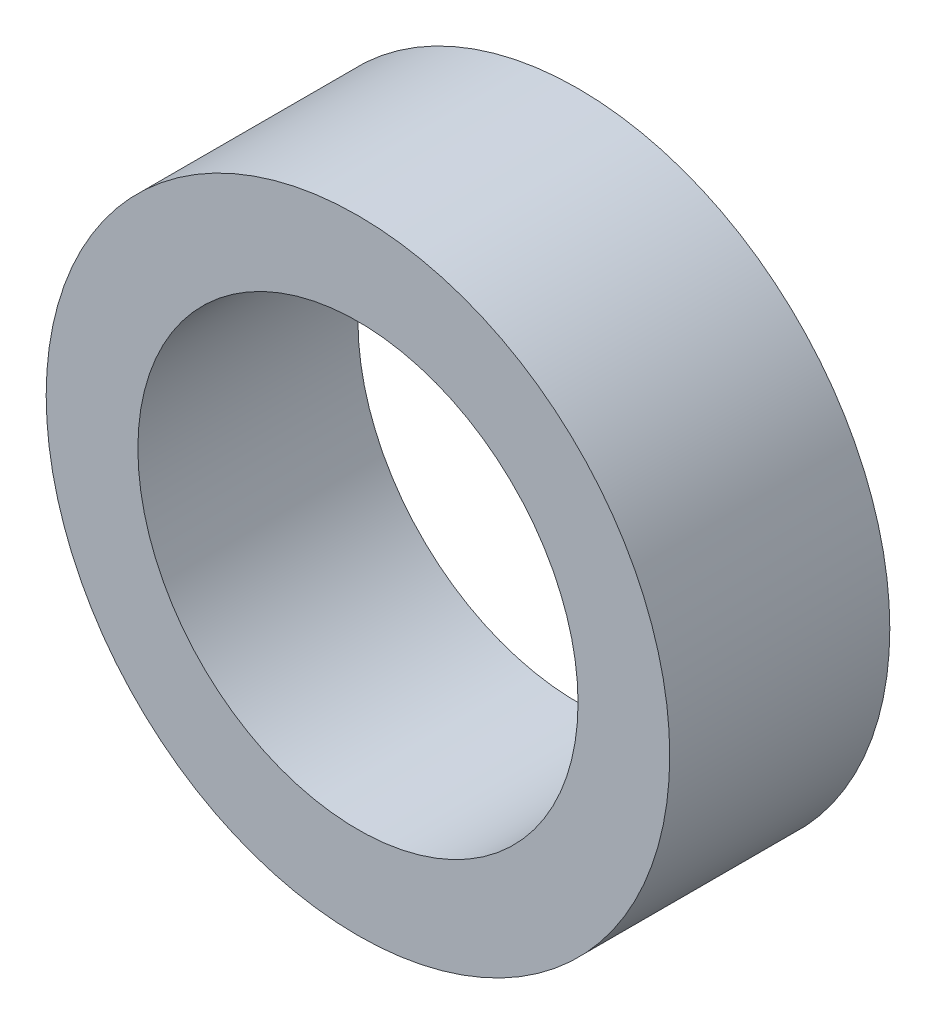
ISO-10303-21;
HEADER;
FILE_DESCRIPTION(('STEP AP214'),'2;1');
FILE_NAME('part.step','',(''),(''),'','','');
FILE_SCHEMA(('AUTOMOTIVE_DESIGN { 1 0 10303 214 1 1 1 1 }'));
ENDSEC;
DATA;
#1=APPLICATION_CONTEXT('core data for automotive mechanical design processes');
#2=APPLICATION_PROTOCOL_DEFINITION('international standard','automotive_design',2000,#1);
#3=PRODUCT_CONTEXT('',#1,'mechanical');
#4=PRODUCT('Part','Part','',(#3));
#5=PRODUCT_RELATED_PRODUCT_CATEGORY('part','',(#4));
#6=PRODUCT_DEFINITION_FORMATION('','',#4);
#7=PRODUCT_DEFINITION_CONTEXT('part definition',#1,'design');
#8=PRODUCT_DEFINITION('design','',#6,#7);
#9=PRODUCT_DEFINITION_SHAPE('','',#8);
#10=(LENGTH_UNIT() NAMED_UNIT(*) SI_UNIT(.MILLI.,.METRE.));
#11=(NAMED_UNIT(*) PLANE_ANGLE_UNIT() SI_UNIT($,.RADIAN.));
#12=(NAMED_UNIT(*) SI_UNIT($,.STERADIAN.) SOLID_ANGLE_UNIT());
#13=UNCERTAINTY_MEASURE_WITH_UNIT(LENGTH_MEASURE(1.E-05),#10,'distance_accuracy_value','');
#14=(GEOMETRIC_REPRESENTATION_CONTEXT(3) GLOBAL_UNCERTAINTY_ASSIGNED_CONTEXT((#13)) GLOBAL_UNIT_ASSIGNED_CONTEXT((#10,
#11,#12)) REPRESENTATION_CONTEXT('',''));
#15=CARTESIAN_POINT('',(0.,0.,0.));
#16=DIRECTION('',(0.,0.,1.));
#17=DIRECTION('',(1.,0.,0.));
#18=AXIS2_PLACEMENT_3D('',#15,#16,#17);
#19=CARTESIAN_POINT('',(0.,0.,-12.));
#20=DIRECTION('',(0.,0.,1.));
#21=DIRECTION('',(1.,0.,0.));
#22=AXIS2_PLACEMENT_3D('',#19,#20,#21);
#23=CYLINDRICAL_SURFACE('',#22,17.);
#24=CARTESIAN_POINT('',(0.,0.,-12.));
#25=DIRECTION('',(0.,0.,1.));
#26=DIRECTION('',(1.,0.,0.));
#27=AXIS2_PLACEMENT_3D('',#24,#25,#26);
#28=CIRCLE('',#27,17.);
#29=CARTESIAN_POINT('',(17.,0.,-12.));
#30=VERTEX_POINT('',#29);
#31=EDGE_CURVE('E10',#30,#30,#28,.T.);
#32=ORIENTED_EDGE('',*,*,#31,.T.);
#33=EDGE_LOOP('',(#32));
#34=FACE_BOUND('',#33,.T.);
#35=CARTESIAN_POINT('',(0.,0.,0.));
#36=DIRECTION('',(0.,0.,1.));
#37=DIRECTION('',(1.,0.,0.));
#38=AXIS2_PLACEMENT_3D('',#35,#36,#37);
#39=CIRCLE('',#38,17.);
#40=CARTESIAN_POINT('',(17.,0.,0.));
#41=VERTEX_POINT('',#40);
#42=EDGE_CURVE('E44',#41,#41,#39,.T.);
#43=ORIENTED_EDGE('',*,*,#42,.F.);
#44=EDGE_LOOP('',(#43));
#45=FACE_BOUND('',#44,.T.);
#46=ADVANCED_FACE('F41',(#34,#45),#23,.T.);
#47=CARTESIAN_POINT('',(0.,0.,-12.));
#48=DIRECTION('',(0.,0.,1.));
#49=DIRECTION('',(1.,0.,0.));
#50=AXIS2_PLACEMENT_3D('',#47,#48,#49);
#51=PLANE('',#50);
#52=CARTESIAN_POINT('',(0.,0.,-12.));
#53=DIRECTION('',(0.,0.,1.));
#54=DIRECTION('',(1.,0.,0.));
#55=AXIS2_PLACEMENT_3D('',#52,#53,#54);
#56=CIRCLE('',#55,12.);
#57=CARTESIAN_POINT('',(12.,0.,-12.));
#58=VERTEX_POINT('',#57);
#59=EDGE_CURVE('E51',#58,#58,#56,.T.);
#60=ORIENTED_EDGE('',*,*,#59,.T.);
#61=EDGE_LOOP('',(#60));
#62=FACE_BOUND('',#61,.T.);
#63=ORIENTED_EDGE('',*,*,#31,.F.);
#64=EDGE_LOOP('',(#63));
#65=FACE_BOUND('',#64,.T.);
#66=ADVANCED_FACE('F59',(#62,#65),#51,.F.);
#67=CARTESIAN_POINT('',(0.,0.,0.));
#68=DIRECTION('',(0.,0.,1.));
#69=DIRECTION('',(1.,0.,0.));
#70=AXIS2_PLACEMENT_3D('',#67,#68,#69);
#71=PLANE('',#70);
#72=CARTESIAN_POINT('',(0.,0.,0.));
#73=DIRECTION('',(0.,0.,1.));
#74=DIRECTION('',(1.,0.,0.));
#75=AXIS2_PLACEMENT_3D('',#72,#73,#74);
#76=CIRCLE('',#75,12.);
#77=CARTESIAN_POINT('',(12.,0.,0.));
#78=VERTEX_POINT('',#77);
#79=EDGE_CURVE('E53',#78,#78,#76,.T.);
#80=ORIENTED_EDGE('',*,*,#79,.F.);
#81=EDGE_LOOP('',(#80));
#82=FACE_BOUND('',#81,.T.);
#83=ORIENTED_EDGE('',*,*,#42,.T.);
#84=EDGE_LOOP('',(#83));
#85=FACE_BOUND('',#84,.T.);
#86=ADVANCED_FACE('F65',(#82,#85),#71,.T.);
#87=CARTESIAN_POINT('',(0.,0.,-12.));
#88=DIRECTION('',(0.,0.,1.));
#89=DIRECTION('',(1.,0.,0.));
#90=AXIS2_PLACEMENT_3D('',#87,#88,#89);
#91=CYLINDRICAL_SURFACE('',#90,12.);
#92=ORIENTED_EDGE('',*,*,#59,.F.);
#93=EDGE_LOOP('',(#92));
#94=FACE_BOUND('',#93,.T.);
#95=ORIENTED_EDGE('',*,*,#79,.T.);
#96=EDGE_LOOP('',(#95));
#97=FACE_BOUND('',#96,.T.);
#98=ADVANCED_FACE('F62',(#94,#97),#91,.F.);
#99=CLOSED_SHELL('',(#46,#66,#86,#98));
#100=MANIFOLD_SOLID_BREP('B2',#99);
#101=ADVANCED_BREP_SHAPE_REPRESENTATION('',(#18,#100),#14);
#102=SHAPE_DEFINITION_REPRESENTATION(#9,#101);
ENDSEC;
END-ISO-10303-21;
